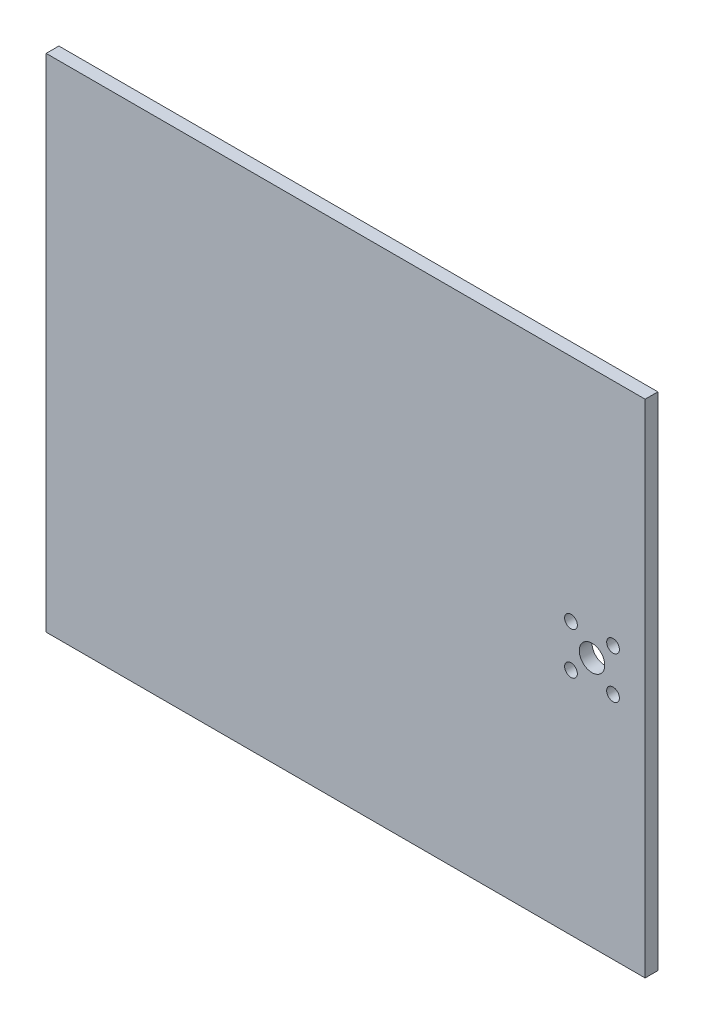
ISO-10303-21;
HEADER;
FILE_DESCRIPTION(('STEP AP214'),'2;1');
FILE_NAME('part.step','',(''),(''),'','','');
FILE_SCHEMA(('AUTOMOTIVE_DESIGN { 1 0 10303 214 1 1 1 1 }'));
ENDSEC;
DATA;
#1=APPLICATION_CONTEXT('core data for automotive mechanical design processes');
#2=APPLICATION_PROTOCOL_DEFINITION('international standard','automotive_design',2000,#1);
#3=PRODUCT_CONTEXT('',#1,'mechanical');
#4=PRODUCT('Part','Part','',(#3));
#5=PRODUCT_RELATED_PRODUCT_CATEGORY('part','',(#4));
#6=PRODUCT_DEFINITION_FORMATION('','',#4);
#7=PRODUCT_DEFINITION_CONTEXT('part definition',#1,'design');
#8=PRODUCT_DEFINITION('design','',#6,#7);
#9=PRODUCT_DEFINITION_SHAPE('','',#8);
#10=(LENGTH_UNIT() NAMED_UNIT(*) SI_UNIT(.MILLI.,.METRE.));
#11=(NAMED_UNIT(*) PLANE_ANGLE_UNIT() SI_UNIT($,.RADIAN.));
#12=(NAMED_UNIT(*) SI_UNIT($,.STERADIAN.) SOLID_ANGLE_UNIT());
#13=UNCERTAINTY_MEASURE_WITH_UNIT(LENGTH_MEASURE(1.E-05),#10,'distance_accuracy_value','');
#14=(GEOMETRIC_REPRESENTATION_CONTEXT(3) GLOBAL_UNCERTAINTY_ASSIGNED_CONTEXT((#13)) GLOBAL_UNIT_ASSIGNED_CONTEXT((#10,
#11,#12)) REPRESENTATION_CONTEXT('',''));
#15=CARTESIAN_POINT('',(0.,0.,0.));
#16=DIRECTION('',(0.,0.,1.));
#17=DIRECTION('',(1.,0.,0.));
#18=AXIS2_PLACEMENT_3D('',#15,#16,#17);
#19=CARTESIAN_POINT('',(150.,-59.,3.));
#20=DIRECTION('',(0.,1.,0.));
#21=DIRECTION('',(-1.,0.,0.));
#22=AXIS2_PLACEMENT_3D('',#19,#20,#21);
#23=PLANE('',#22);
#24=DIRECTION('',(1.,0.,0.));
#25=VECTOR('',#24,1.);
#26=CARTESIAN_POINT('',(150.,-59.,3.));
#27=LINE('',#26,#25);
#28=CARTESIAN_POINT('',(9.00000000000004,-59.,3.));
#29=VERTEX_POINT('',#28);
#30=CARTESIAN_POINT('',(150.,-59.,3.));
#31=VERTEX_POINT('',#30);
#32=EDGE_CURVE('E99',#29,#31,#27,.T.);
#33=ORIENTED_EDGE('',*,*,#32,.F.);
#34=DIRECTION('',(0.,0.,1.));
#35=VECTOR('',#34,1.);
#36=CARTESIAN_POINT('',(9.00000000000004,-59.,-7.));
#37=LINE('',#36,#35);
#38=CARTESIAN_POINT('',(9.00000000000004,-59.,0.));
#39=VERTEX_POINT('',#38);
#40=EDGE_CURVE('E155',#39,#29,#37,.T.);
#41=ORIENTED_EDGE('',*,*,#40,.F.);
#42=DIRECTION('',(1.,0.,0.));
#43=VECTOR('',#42,1.);
#44=CARTESIAN_POINT('',(150.,-59.,0.));
#45=LINE('',#44,#43);
#46=CARTESIAN_POINT('',(150.,-59.,0.));
#47=VERTEX_POINT('',#46);
#48=EDGE_CURVE('E89',#39,#47,#45,.T.);
#49=ORIENTED_EDGE('',*,*,#48,.T.);
#50=DIRECTION('',(0.,0.,-1.));
#51=VECTOR('',#50,1.);
#52=CARTESIAN_POINT('',(150.,-59.,3.));
#53=LINE('',#52,#51);
#54=EDGE_CURVE('E50',#31,#47,#53,.T.);
#55=ORIENTED_EDGE('',*,*,#54,.F.);
#56=EDGE_LOOP('',(#33,#41,#49,#55));
#57=FACE_BOUND('',#56,.T.);
#58=ADVANCED_FACE('F42',(#57),#23,.F.);
#59=CARTESIAN_POINT('',(150.,-59.,3.));
#60=DIRECTION('',(-1.,0.,0.));
#61=DIRECTION('',(0.,0.,1.));
#62=AXIS2_PLACEMENT_3D('',#59,#60,#61);
#63=PLANE('',#62);
#64=DIRECTION('',(0.,1.,0.));
#65=VECTOR('',#64,1.);
#66=CARTESIAN_POINT('',(150.,-59.,0.));
#67=LINE('',#66,#65);
#68=CARTESIAN_POINT('',(150.,59.,0.));
#69=VERTEX_POINT('',#68);
#70=EDGE_CURVE('E78',#47,#69,#67,.T.);
#71=ORIENTED_EDGE('',*,*,#70,.T.);
#72=DIRECTION('',(0.,0.,-1.));
#73=VECTOR('',#72,1.);
#74=CARTESIAN_POINT('',(150.,59.,3.));
#75=LINE('',#74,#73);
#76=CARTESIAN_POINT('',(150.,59.,3.));
#77=VERTEX_POINT('',#76);
#78=EDGE_CURVE('E81',#77,#69,#75,.T.);
#79=ORIENTED_EDGE('',*,*,#78,.F.);
#80=DIRECTION('',(0.,1.,0.));
#81=VECTOR('',#80,1.);
#82=CARTESIAN_POINT('',(150.,-59.,3.));
#83=LINE('',#82,#81);
#84=EDGE_CURVE('E65',#31,#77,#83,.T.);
#85=ORIENTED_EDGE('',*,*,#84,.F.);
#86=ORIENTED_EDGE('',*,*,#54,.T.);
#87=EDGE_LOOP('',(#71,#79,#85,#86));
#88=FACE_BOUND('',#87,.T.);
#89=ADVANCED_FACE('F80',(#88),#63,.F.);
#90=CARTESIAN_POINT('',(150.,59.,3.));
#91=DIRECTION('',(0.,-1.,0.));
#92=DIRECTION('',(1.,0.,0.));
#93=AXIS2_PLACEMENT_3D('',#90,#91,#92);
#94=PLANE('',#93);
#95=DIRECTION('',(-1.,0.,0.));
#96=VECTOR('',#95,1.);
#97=CARTESIAN_POINT('',(150.,59.,0.));
#98=LINE('',#97,#96);
#99=CARTESIAN_POINT('',(9.00000000000004,59.,0.));
#100=VERTEX_POINT('',#99);
#101=EDGE_CURVE('E88',#69,#100,#98,.T.);
#102=ORIENTED_EDGE('',*,*,#101,.T.);
#103=DIRECTION('',(0.,0.,1.));
#104=VECTOR('',#103,1.);
#105=CARTESIAN_POINT('',(9.00000000000004,59.,-7.));
#106=LINE('',#105,#104);
#107=CARTESIAN_POINT('',(9.00000000000004,59.,3.));
#108=VERTEX_POINT('',#107);
#109=EDGE_CURVE('E57',#100,#108,#106,.T.);
#110=ORIENTED_EDGE('',*,*,#109,.T.);
#111=DIRECTION('',(-1.,0.,0.));
#112=VECTOR('',#111,1.);
#113=CARTESIAN_POINT('',(150.,59.,3.));
#114=LINE('',#113,#112);
#115=EDGE_CURVE('E94',#77,#108,#114,.T.);
#116=ORIENTED_EDGE('',*,*,#115,.F.);
#117=ORIENTED_EDGE('',*,*,#78,.T.);
#118=EDGE_LOOP('',(#102,#110,#116,#117));
#119=FACE_BOUND('',#118,.T.);
#120=ADVANCED_FACE('F93',(#119),#94,.F.);
#121=CARTESIAN_POINT('',(0.,0.,3.));
#122=DIRECTION('',(0.,0.,1.));
#123=DIRECTION('',(1.,0.,0.));
#124=AXIS2_PLACEMENT_3D('',#121,#122,#123);
#125=PLANE('',#124);
#126=DIRECTION('',(0.,1.,0.));
#127=VECTOR('',#126,1.);
#128=CARTESIAN_POINT('',(9.00000000000004,59.,3.));
#129=LINE('',#128,#127);
#130=EDGE_CURVE('E159',#29,#108,#129,.T.);
#131=ORIENTED_EDGE('',*,*,#130,.F.);
#132=ORIENTED_EDGE('',*,*,#32,.T.);
#133=ORIENTED_EDGE('',*,*,#84,.T.);
#134=ORIENTED_EDGE('',*,*,#115,.T.);
#135=EDGE_LOOP('',(#131,#132,#133,#134));
#136=FACE_BOUND('',#135,.T.);
#137=CARTESIAN_POINT('',(132.550252531694,-4.94974746830588,3.));
#138=DIRECTION('',(0.,0.,-1.));
#139=DIRECTION('',(-1.,0.,0.));
#140=AXIS2_PLACEMENT_3D('',#137,#138,#139);
#141=CIRCLE('',#140,1.5);
#142=CARTESIAN_POINT('',(131.050252531694,-4.94974746830588,3.));
#143=VERTEX_POINT('',#142);
#144=EDGE_CURVE('E124',#143,#143,#141,.T.);
#145=ORIENTED_EDGE('',*,*,#144,.T.);
#146=EDGE_LOOP('',(#145));
#147=FACE_BOUND('',#146,.T.);
#148=CARTESIAN_POINT('',(142.449747468306,-4.94974746830588,3.));
#149=DIRECTION('',(0.,0.,-1.));
#150=DIRECTION('',(-1.,0.,0.));
#151=AXIS2_PLACEMENT_3D('',#148,#149,#150);
#152=CIRCLE('',#151,1.5);
#153=CARTESIAN_POINT('',(140.949747468306,-4.94974746830588,3.));
#154=VERTEX_POINT('',#153);
#155=EDGE_CURVE('E132',#154,#154,#152,.T.);
#156=ORIENTED_EDGE('',*,*,#155,.T.);
#157=EDGE_LOOP('',(#156));
#158=FACE_BOUND('',#157,.T.);
#159=CARTESIAN_POINT('',(137.5,0.,3.));
#160=DIRECTION('',(0.,0.,-1.));
#161=DIRECTION('',(-1.,0.,0.));
#162=AXIS2_PLACEMENT_3D('',#159,#160,#161);
#163=CIRCLE('',#162,2.99999999999999);
#164=CARTESIAN_POINT('',(134.5,0.,3.));
#165=VERTEX_POINT('',#164);
#166=EDGE_CURVE('E140',#165,#165,#163,.T.);
#167=ORIENTED_EDGE('',*,*,#166,.T.);
#168=EDGE_LOOP('',(#167));
#169=FACE_BOUND('',#168,.T.);
#170=CARTESIAN_POINT('',(132.550252531694,4.94974746830591,3.));
#171=DIRECTION('',(0.,0.,-1.));
#172=DIRECTION('',(-1.,0.,0.));
#173=AXIS2_PLACEMENT_3D('',#170,#171,#172);
#174=CIRCLE('',#173,1.5);
#175=CARTESIAN_POINT('',(131.050252531694,4.94974746830591,3.));
#176=VERTEX_POINT('',#175);
#177=EDGE_CURVE('E148',#176,#176,#174,.T.);
#178=ORIENTED_EDGE('',*,*,#177,.T.);
#179=EDGE_LOOP('',(#178));
#180=FACE_BOUND('',#179,.T.);
#181=CARTESIAN_POINT('',(142.449747468306,4.94974746830591,3.));
#182=DIRECTION('',(0.,0.,-1.));
#183=DIRECTION('',(-1.,0.,0.));
#184=AXIS2_PLACEMENT_3D('',#181,#182,#183);
#185=CIRCLE('',#184,1.5);
#186=CARTESIAN_POINT('',(140.949747468306,4.94974746830591,3.));
#187=VERTEX_POINT('',#186);
#188=EDGE_CURVE('E111',#187,#187,#185,.T.);
#189=ORIENTED_EDGE('',*,*,#188,.T.);
#190=EDGE_LOOP('',(#189));
#191=FACE_BOUND('',#190,.T.);
#192=ADVANCED_FACE('F169',(#136,#147,#158,#169,#180,#191),#125,.T.);
#193=CARTESIAN_POINT('',(0.,0.,0.));
#194=DIRECTION('',(0.,0.,1.));
#195=DIRECTION('',(1.,0.,0.));
#196=AXIS2_PLACEMENT_3D('',#193,#194,#195);
#197=PLANE('',#196);
#198=CARTESIAN_POINT('',(132.550252531694,-4.94974746830588,0.));
#199=DIRECTION('',(0.,0.,-1.));
#200=DIRECTION('',(-1.,0.,0.));
#201=AXIS2_PLACEMENT_3D('',#198,#199,#200);
#202=CIRCLE('',#201,1.5);
#203=CARTESIAN_POINT('',(131.050252531694,-4.94974746830588,0.));
#204=VERTEX_POINT('',#203);
#205=EDGE_CURVE('E128',#204,#204,#202,.T.);
#206=ORIENTED_EDGE('',*,*,#205,.F.);
#207=EDGE_LOOP('',(#206));
#208=FACE_BOUND('',#207,.T.);
#209=CARTESIAN_POINT('',(142.449747468306,-4.94974746830588,0.));
#210=DIRECTION('',(0.,0.,-1.));
#211=DIRECTION('',(-1.,0.,0.));
#212=AXIS2_PLACEMENT_3D('',#209,#210,#211);
#213=CIRCLE('',#212,1.5);
#214=CARTESIAN_POINT('',(140.949747468306,-4.94974746830588,0.));
#215=VERTEX_POINT('',#214);
#216=EDGE_CURVE('E136',#215,#215,#213,.T.);
#217=ORIENTED_EDGE('',*,*,#216,.F.);
#218=EDGE_LOOP('',(#217));
#219=FACE_BOUND('',#218,.T.);
#220=CARTESIAN_POINT('',(137.5,0.,0.));
#221=DIRECTION('',(0.,0.,-1.));
#222=DIRECTION('',(-1.,0.,0.));
#223=AXIS2_PLACEMENT_3D('',#220,#221,#222);
#224=CIRCLE('',#223,2.99999999999999);
#225=CARTESIAN_POINT('',(134.5,0.,0.));
#226=VERTEX_POINT('',#225);
#227=EDGE_CURVE('E144',#226,#226,#224,.T.);
#228=ORIENTED_EDGE('',*,*,#227,.F.);
#229=EDGE_LOOP('',(#228));
#230=FACE_BOUND('',#229,.T.);
#231=CARTESIAN_POINT('',(132.550252531694,4.94974746830591,0.));
#232=DIRECTION('',(0.,0.,-1.));
#233=DIRECTION('',(-1.,0.,0.));
#234=AXIS2_PLACEMENT_3D('',#231,#232,#233);
#235=CIRCLE('',#234,1.5);
#236=CARTESIAN_POINT('',(131.050252531694,4.94974746830591,0.));
#237=VERTEX_POINT('',#236);
#238=EDGE_CURVE('E122',#237,#237,#235,.T.);
#239=ORIENTED_EDGE('',*,*,#238,.F.);
#240=EDGE_LOOP('',(#239));
#241=FACE_BOUND('',#240,.T.);
#242=CARTESIAN_POINT('',(142.449747468306,4.94974746830591,0.));
#243=DIRECTION('',(0.,0.,-1.));
#244=DIRECTION('',(-1.,0.,0.));
#245=AXIS2_PLACEMENT_3D('',#242,#243,#244);
#246=CIRCLE('',#245,1.5);
#247=CARTESIAN_POINT('',(140.949747468306,4.94974746830591,0.));
#248=VERTEX_POINT('',#247);
#249=EDGE_CURVE('E116',#248,#248,#246,.T.);
#250=ORIENTED_EDGE('',*,*,#249,.F.);
#251=EDGE_LOOP('',(#250));
#252=FACE_BOUND('',#251,.T.);
#253=ORIENTED_EDGE('',*,*,#48,.F.);
#254=DIRECTION('',(0.,1.,0.));
#255=VECTOR('',#254,1.);
#256=CARTESIAN_POINT('',(9.00000000000004,0.,0.));
#257=LINE('',#256,#255);
#258=EDGE_CURVE('E11',#39,#100,#257,.T.);
#259=ORIENTED_EDGE('',*,*,#258,.T.);
#260=ORIENTED_EDGE('',*,*,#101,.F.);
#261=ORIENTED_EDGE('',*,*,#70,.F.);
#262=EDGE_LOOP('',(#253,#259,#260,#261));
#263=FACE_BOUND('',#262,.T.);
#264=ADVANCED_FACE('F97',(#208,#219,#230,#241,#252,#263),#197,.F.);
#265=CARTESIAN_POINT('',(142.449747468306,4.94974746830591,3.));
#266=DIRECTION('',(0.,0.,-1.));
#267=DIRECTION('',(-1.,0.,0.));
#268=AXIS2_PLACEMENT_3D('',#265,#266,#267);
#269=CYLINDRICAL_SURFACE('',#268,1.5);
#270=ORIENTED_EDGE('',*,*,#188,.F.);
#271=EDGE_LOOP('',(#270));
#272=FACE_BOUND('',#271,.T.);
#273=ORIENTED_EDGE('',*,*,#249,.T.);
#274=EDGE_LOOP('',(#273));
#275=FACE_BOUND('',#274,.T.);
#276=ADVANCED_FACE('F185',(#272,#275),#269,.F.);
#277=CARTESIAN_POINT('',(132.550252531694,4.94974746830591,3.));
#278=DIRECTION('',(0.,0.,-1.));
#279=DIRECTION('',(-1.,0.,0.));
#280=AXIS2_PLACEMENT_3D('',#277,#278,#279);
#281=CYLINDRICAL_SURFACE('',#280,1.5);
#282=ORIENTED_EDGE('',*,*,#177,.F.);
#283=EDGE_LOOP('',(#282));
#284=FACE_BOUND('',#283,.T.);
#285=ORIENTED_EDGE('',*,*,#238,.T.);
#286=EDGE_LOOP('',(#285));
#287=FACE_BOUND('',#286,.T.);
#288=ADVANCED_FACE('F181',(#284,#287),#281,.F.);
#289=CARTESIAN_POINT('',(137.5,0.,3.));
#290=DIRECTION('',(0.,0.,-1.));
#291=DIRECTION('',(-1.,0.,0.));
#292=AXIS2_PLACEMENT_3D('',#289,#290,#291);
#293=CYLINDRICAL_SURFACE('',#292,2.99999999999999);
#294=ORIENTED_EDGE('',*,*,#166,.F.);
#295=EDGE_LOOP('',(#294));
#296=FACE_BOUND('',#295,.T.);
#297=ORIENTED_EDGE('',*,*,#227,.T.);
#298=EDGE_LOOP('',(#297));
#299=FACE_BOUND('',#298,.T.);
#300=ADVANCED_FACE('F184',(#296,#299),#293,.F.);
#301=CARTESIAN_POINT('',(142.449747468306,-4.94974746830588,3.));
#302=DIRECTION('',(0.,0.,-1.));
#303=DIRECTION('',(-1.,0.,0.));
#304=AXIS2_PLACEMENT_3D('',#301,#302,#303);
#305=CYLINDRICAL_SURFACE('',#304,1.5);
#306=ORIENTED_EDGE('',*,*,#155,.F.);
#307=EDGE_LOOP('',(#306));
#308=FACE_BOUND('',#307,.T.);
#309=ORIENTED_EDGE('',*,*,#216,.T.);
#310=EDGE_LOOP('',(#309));
#311=FACE_BOUND('',#310,.T.);
#312=ADVANCED_FACE('F237',(#308,#311),#305,.F.);
#313=CARTESIAN_POINT('',(132.550252531694,-4.94974746830588,3.));
#314=DIRECTION('',(0.,0.,-1.));
#315=DIRECTION('',(-1.,0.,0.));
#316=AXIS2_PLACEMENT_3D('',#313,#314,#315);
#317=CYLINDRICAL_SURFACE('',#316,1.5);
#318=ORIENTED_EDGE('',*,*,#144,.F.);
#319=EDGE_LOOP('',(#318));
#320=FACE_BOUND('',#319,.T.);
#321=ORIENTED_EDGE('',*,*,#205,.T.);
#322=EDGE_LOOP('',(#321));
#323=FACE_BOUND('',#322,.T.);
#324=ADVANCED_FACE('F227',(#320,#323),#317,.F.);
#325=CARTESIAN_POINT('',(9.00000000000004,59.,-7.));
#326=DIRECTION('',(1.,0.,0.));
#327=DIRECTION('',(0.,0.,-1.));
#328=AXIS2_PLACEMENT_3D('',#325,#326,#327);
#329=PLANE('',#328);
#330=ORIENTED_EDGE('',*,*,#40,.T.);
#331=ORIENTED_EDGE('',*,*,#130,.T.);
#332=ORIENTED_EDGE('',*,*,#109,.F.);
#333=ORIENTED_EDGE('',*,*,#258,.F.);
#334=EDGE_LOOP('',(#330,#331,#332,#333));
#335=FACE_BOUND('',#334,.T.);
#336=ADVANCED_FACE('F165',(#335),#329,.F.);
#337=CLOSED_SHELL('',(#58,#89,#120,#192,#264,#276,#288,#300,#312,#324,#336));
#338=MANIFOLD_SOLID_BREP('B2',#337);
#339=ADVANCED_BREP_SHAPE_REPRESENTATION('',(#18,#338),#14);
#340=SHAPE_DEFINITION_REPRESENTATION(#9,#339);
ENDSEC;
END-ISO-10303-21;
